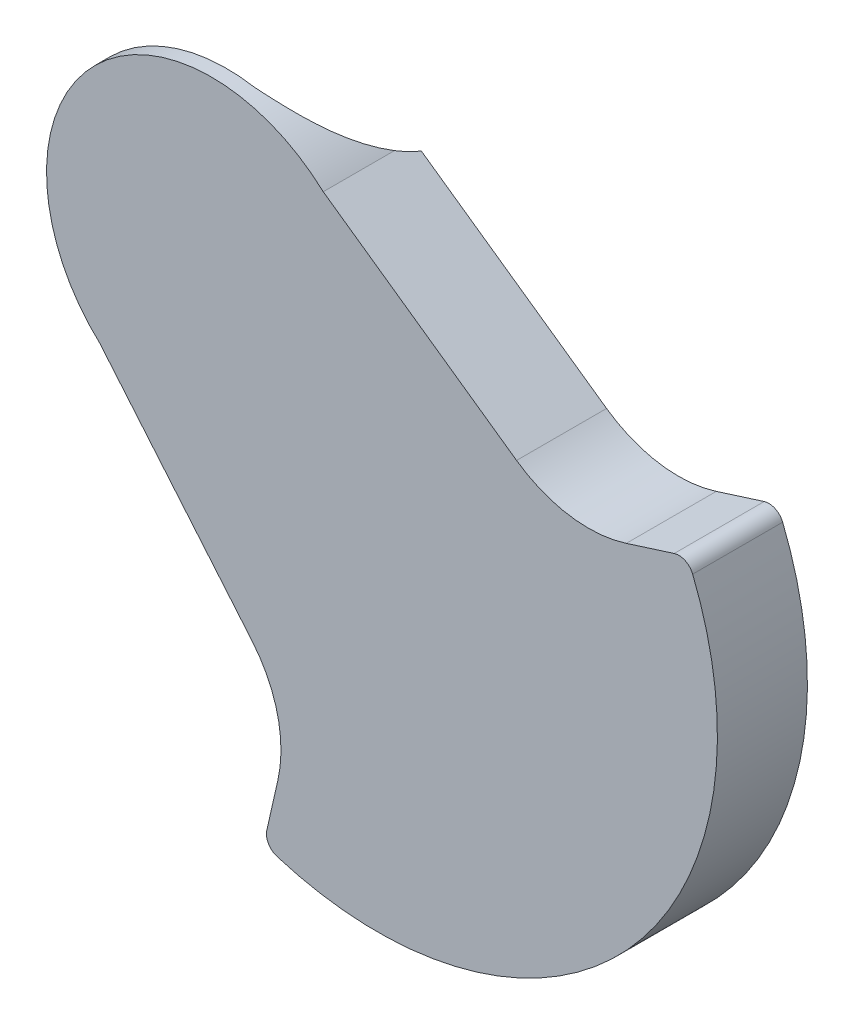
ISO-10303-21;
HEADER;
FILE_DESCRIPTION(('STEP AP214'),'2;1');
FILE_NAME('part.step','',(''),(''),'','','');
FILE_SCHEMA(('AUTOMOTIVE_DESIGN { 1 0 10303 214 1 1 1 1 }'));
ENDSEC;
DATA;
#1=APPLICATION_CONTEXT('core data for automotive mechanical design processes');
#2=APPLICATION_PROTOCOL_DEFINITION('international standard','automotive_design',2000,#1);
#3=PRODUCT_CONTEXT('',#1,'mechanical');
#4=PRODUCT('Part','Part','',(#3));
#5=PRODUCT_RELATED_PRODUCT_CATEGORY('part','',(#4));
#6=PRODUCT_DEFINITION_FORMATION('','',#4);
#7=PRODUCT_DEFINITION_CONTEXT('part definition',#1,'design');
#8=PRODUCT_DEFINITION('design','',#6,#7);
#9=PRODUCT_DEFINITION_SHAPE('','',#8);
#10=(LENGTH_UNIT() NAMED_UNIT(*) SI_UNIT(.MILLI.,.METRE.));
#11=(NAMED_UNIT(*) PLANE_ANGLE_UNIT() SI_UNIT($,.RADIAN.));
#12=(NAMED_UNIT(*) SI_UNIT($,.STERADIAN.) SOLID_ANGLE_UNIT());
#13=UNCERTAINTY_MEASURE_WITH_UNIT(LENGTH_MEASURE(1.E-05),#10,'distance_accuracy_value','');
#14=(GEOMETRIC_REPRESENTATION_CONTEXT(3) GLOBAL_UNCERTAINTY_ASSIGNED_CONTEXT((#13)) GLOBAL_UNIT_ASSIGNED_CONTEXT((#10,
#11,#12)) REPRESENTATION_CONTEXT('',''));
#15=CARTESIAN_POINT('',(0.,0.,0.));
#16=DIRECTION('',(0.,0.,1.));
#17=DIRECTION('',(1.,0.,0.));
#18=AXIS2_PLACEMENT_3D('',#15,#16,#17);
#19=CARTESIAN_POINT('',(-26.9907159954637,85.9098437319744,-364.369237082393));
#20=DIRECTION('',(0.,0.,1.));
#21=DIRECTION('',(0.,-1.,0.));
#22=AXIS2_PLACEMENT_3D('',#19,#20,#21);
#23=PLANE('',#22);
#24=DIRECTION('',(-0.676579799148893,-0.736369319963593,0.));
#25=VECTOR('',#24,1.);
#26=CARTESIAN_POINT('',(-15.8365381639596,75.6613295797509,-364.369237082393));
#27=LINE('',#26,#25);
#28=CARTESIAN_POINT('',(-27.5047740204315,62.9619688929353,-364.369237082393));
#29=VERTEX_POINT('',#28);
#30=CARTESIAN_POINT('',(-65.0604842308882,22.0874514698433,-364.369237082393));
#31=VERTEX_POINT('',#30);
#32=EDGE_CURVE('E131',#29,#31,#27,.T.);
#33=ORIENTED_EDGE('',*,*,#32,.T.);
#34=CARTESIAN_POINT('',(-33.1366193983653,30.4460909616992,-364.369237082393));
#35=DIRECTION('',(0.,0.,1.));
#36=DIRECTION('',(1.,0.,0.));
#37=AXIS2_PLACEMENT_3D('',#34,#35,#36);
#38=CIRCLE('',#37,33.);
#39=EDGE_CURVE('E266',#29,#31,#38,.T.);
#40=ORIENTED_EDGE('',*,*,#39,.F.);
#41=EDGE_LOOP('',(#33,#40));
#42=FACE_BOUND('',#41,.T.);
#43=ADVANCED_FACE('F17',(#42),#23,.F.);
#44=CARTESIAN_POINT('',(-18.0962882731668,77.7375992362456,-389.035665735474));
#45=DIRECTION('',(-0.676579799148893,-0.736369319963593,0.));
#46=DIRECTION('',(0.736369319963593,-0.676579799148893,0.));
#47=AXIS2_PLACEMENT_3D('',#44,#45,#46);
#48=CYLINDRICAL_SURFACE('',#47,24.8565900465059);
#49=DIRECTION('',(0.676579799148892,0.736369319963593,0.));
#50=VECTOR('',#49,1.);
#51=CARTESIAN_POINT('',(-54.1816294947552,4.61667075283123,-379.369237082393));
#52=LINE('',#51,#50);
#53=CARTESIAN_POINT('',(-54.1816294947552,4.61667075283121,-379.369237082393));
#54=VERTEX_POINT('',#53);
#55=CARTESIAN_POINT('',(-9.17740685872837,53.5979274496312,-379.369237082393));
#56=VERTEX_POINT('',#55);
#57=EDGE_CURVE('E112',#54,#56,#52,.T.);
#58=ORIENTED_EDGE('',*,*,#57,.F.);
#59=CARTESIAN_POINT('',(-69.0194913630283,22.3143003484863,-389.035665735474));
#60=DIRECTION('',(0.766304765262673,0.642477242192842,0.));
#61=DIRECTION('',(0.642477242192842,-0.766304765262673,0.));
#62=AXIS2_PLACEMENT_3D('',#59,#60,#61);
#63=ELLIPSE('',#62,25.0679920813008,24.8565900465059);
#64=CARTESIAN_POINT('',(-55.4637527702787,6.14590340290062,-375.613603542839));
#65=VERTEX_POINT('',#64);
#66=EDGE_CURVE('E264',#54,#65,#63,.F.);
#67=ORIENTED_EDGE('',*,*,#66,.T.);
#68=CARTESIAN_POINT('',(-65.0604842308881,22.0874514698431,-364.369237082393));
#69=CARTESIAN_POINT('',(-64.9840159927386,21.7953720487139,-364.400823792457));
#70=CARTESIAN_POINT('',(-64.9036362497375,21.5047657215805,-364.436634946942));
#71=CARTESIAN_POINT('',(-64.7353002869108,20.9269625260206,-364.517059269426));
#72=CARTESIAN_POINT('',(-64.6473434824417,20.639765922636,-364.561673116982));
#73=CARTESIAN_POINT('',(-64.4640760333072,20.0691792943719,-364.660070393074));
#74=CARTESIAN_POINT('',(-64.3687625296237,19.7857908001744,-364.713857396477));
#75=CARTESIAN_POINT('',(-64.1711418300038,19.2234671943748,-364.830881674098));
#76=CARTESIAN_POINT('',(-64.0688348072806,18.9445319726867,-364.894118714306));
#77=CARTESIAN_POINT('',(-63.7523431880267,18.1162072574784,-365.098165043031));
#78=CARTESIAN_POINT('',(-63.5281919455665,17.5740704030197,-365.253518237469));
#79=CARTESIAN_POINT('',(-63.0568663126145,16.5135515867837,-365.604511983135));
#80=CARTESIAN_POINT('',(-62.8096962041235,15.9951652335675,-365.800145049614));
#81=CARTESIAN_POINT('',(-62.2956374727821,14.9840660740643,-366.233087241402));
#82=CARTESIAN_POINT('',(-62.028692587333,14.4914339000559,-366.470518150075));
#83=CARTESIAN_POINT('',(-61.4804437872218,13.5366029944839,-366.986531070002));
#84=CARTESIAN_POINT('',(-61.1991386885859,13.0744067795282,-367.265116477968));
#85=CARTESIAN_POINT('',(-60.6273188787542,12.1829623308992,-367.862428695284));
#86=CARTESIAN_POINT('',(-60.3368054904221,11.7537093946334,-368.181149758125));
#87=CARTESIAN_POINT('',(-59.7517835654479,10.9297290725584,-368.857113567319));
#88=CARTESIAN_POINT('',(-59.4572752498287,10.5349997856247,-369.214354190081));
#89=CARTESIAN_POINT('',(-58.8756739602041,9.78888600617124,-369.957252897638));
#90=CARTESIAN_POINT('',(-58.5885560284565,9.43676062240041,-370.34214897427));
#91=CARTESIAN_POINT('',(-58.020106477675,8.76648690332238,-371.144500232092));
#92=CARTESIAN_POINT('',(-57.7387755805071,8.44834278628382,-371.561959444407));
#93=CARTESIAN_POINT('',(-57.186660856882,7.84604025878549,-372.426378156421));
#94=CARTESIAN_POINT('',(-56.9158664833569,7.56184724059178,-372.873306882615));
#95=CARTESIAN_POINT('',(-56.3886995673503,7.0264011915632,-373.794282777253));
#96=CARTESIAN_POINT('',(-56.1323202264009,6.77513255714503,-374.268316945717));
#97=CARTESIAN_POINT('',(-55.8132041742103,6.47147246414163,-374.89574385078));
#98=CARTESIAN_POINT('',(-55.7421343733781,6.40446150942822,-375.038012685529));
#99=CARTESIAN_POINT('',(-55.6016821650591,6.27316843986641,-375.324397305162));
#100=CARTESIAN_POINT('',(-55.532297964601,6.20888336586761,-375.468510853989));
#101=CARTESIAN_POINT('',(-55.4637527702787,6.1459034029006,-375.613603542839));
#102=B_SPLINE_CURVE_WITH_KNOTS('',3,(#68,#69,#70,#71,#72,#73,#74,#75,#76,#77,#78,#79,#80,#81,
#82,#83,#84,#85,#86,#87,#88,#89,#90,#91,#92,#93,#94,#95,#96,#97,#98,#99,#100,#101),
.UNSPECIFIED.,.F.,.F.,(4,2,2,2,2,2,2,2,2,2,2,2,2,2,2,2,4),(0.,0.910665562816889,
1.82140145532528,2.73249308472106,3.64356215669008,5.46179044311325,7.27968117326937,
9.10295897477726,10.9263873458348,12.7495549398196,14.5726220735728,16.3570820503147,
18.1417632843967,19.9246095107919,21.7066077277444,22.224304437158,22.7414239541458),.UNSPECIFIED.);
#103=EDGE_CURVE('E177',#31,#65,#102,.T.);
#104=ORIENTED_EDGE('',*,*,#103,.F.);
#105=ORIENTED_EDGE('',*,*,#32,.F.);
#106=CARTESIAN_POINT('',(-10.8094860264519,54.7462785204978,-375.613603542839));
#107=CARTESIAN_POINT('',(-10.9356589391007,54.862203413725,-375.34652875261));
#108=CARTESIAN_POINT('',(-11.0664855084637,54.9805986151833,-375.082761834512));
#109=CARTESIAN_POINT('',(-11.3376045254192,55.2218032106871,-374.562186668994));
#110=CARTESIAN_POINT('',(-11.4778974012697,55.3446128043231,-374.305378737138));
#111=CARTESIAN_POINT('',(-11.9132543943218,55.7189078987021,-373.545841129367));
#112=CARTESIAN_POINT('',(-12.2227458730638,55.9762123065114,-373.054106154957));
#113=CARTESIAN_POINT('',(-12.8806033239174,56.5012406774238,-372.103651379812));
#114=CARTESIAN_POINT('',(-13.2289553007062,56.7689608668827,-371.644919790428));
#115=CARTESIAN_POINT('',(-13.9648200256905,57.3096435252333,-370.763421294247));
#116=CARTESIAN_POINT('',(-14.3523265834485,57.5826051599294,-370.340648721645));
#117=CARTESIAN_POINT('',(-15.167988854671,58.1294876448721,-369.532095184414));
#118=CARTESIAN_POINT('',(-15.5963236875032,58.4034071176867,-369.146493694093));
#119=CARTESIAN_POINT('',(-16.4909081064042,58.9451023979783,-368.417095470555));
#120=CARTESIAN_POINT('',(-16.9571599437059,59.2128778394559,-368.073301222574));
#121=CARTESIAN_POINT('',(-17.9247804713075,59.736055513225,-367.429987513239));
#122=CARTESIAN_POINT('',(-18.4261050434514,59.9914726301869,-367.130413851745));
#123=CARTESIAN_POINT('',(-19.4612376238101,60.4846072939544,-366.576313640181));
#124=CARTESIAN_POINT('',(-19.995042045836,60.7223267883813,-366.32178212897));
#125=CARTESIAN_POINT('',(-21.0786827553908,61.169729511281,-365.863331076548));
#126=CARTESIAN_POINT('',(-21.6278742145385,61.3799291600736,-365.658388151964));
#127=CARTESIAN_POINT('',(-22.7495085764923,61.7743719832773,-365.291028645362));
#128=CARTESIAN_POINT('',(-23.3219557321771,61.9586103822536,-365.128619882574));
#129=CARTESIAN_POINT('',(-24.195873894524,62.2133071191776,-364.915401139943));
#130=CARTESIAN_POINT('',(-24.4905374626516,62.2947862902146,-364.849256872414));
#131=CARTESIAN_POINT('',(-25.083994345032,62.4499851256295,-364.727014801964));
#132=CARTESIAN_POINT('',(-25.3827877725527,62.5237045767051,-364.670917275183));
#133=CARTESIAN_POINT('',(-25.9837776051821,62.6630423394143,-364.568473032463));
#134=CARTESIAN_POINT('',(-26.28597264753,62.7286637774908,-364.522122548535));
#135=CARTESIAN_POINT('',(-26.8933013997838,62.8516011838212,-364.438767580703));
#136=CARTESIAN_POINT('',(-27.1984348604205,62.9089178500733,-364.401762311159));
#137=CARTESIAN_POINT('',(-27.5047740204315,62.9619688929353,-364.369237082393));
#138=B_SPLINE_CURVE_WITH_KNOTS('',3,(#106,#107,#108,#109,#110,#111,#112,#113,#114,#115,#116,
#117,#118,#119,#120,#121,#122,#123,#124,#125,#126,#127,#128,#129,#130,#131,#132,#133,#134,#135,
#136,#137),.UNSPECIFIED.,.F.,.F.,(4,2,2,2,2,2,2,2,2,2,2,2,2,2,2,4),(0.,0.951811090606709,
1.90366527028978,3.8077593276666,5.71116984000966,7.61427988785294,9.52616132703893,
11.4381563626768,13.3477880968241,15.2572093645925,17.1230103250728,18.9891540430135,
19.9273050023867,20.8654817433069,21.8032951365907,22.7410296629079),.UNSPECIFIED.);
#139=CARTESIAN_POINT('',(-10.8094860264518,54.7462785204978,-375.613603542839));
#140=VERTEX_POINT('',#139);
#141=EDGE_CURVE('E169',#140,#29,#138,.T.);
#142=ORIENTED_EDGE('',*,*,#141,.F.);
#143=CARTESIAN_POINT('',(-28.0652671067057,66.8876593272816,-389.035665735474));
#144=DIRECTION('',(-0.575443440708408,-0.817841577902266,0.));
#145=DIRECTION('',(-0.817841577902266,0.575443440708408,0.));
#146=AXIS2_PLACEMENT_3D('',#143,#144,#145);
#147=ELLIPSE('',#146,25.0679920813008,24.8565900465059);
#148=EDGE_CURVE('E165',#140,#56,#147,.F.);
#149=ORIENTED_EDGE('',*,*,#148,.T.);
#150=EDGE_LOOP('',(#58,#67,#104,#105,#142,#149));
#151=FACE_BOUND('',#150,.T.);
#152=ADVANCED_FACE('F182',(#151),#48,.F.);
#153=CARTESIAN_POINT('',(23.6802929702076,25.7729261987248,-379.369237082393));
#154=DIRECTION('',(0.,0.,-1.));
#155=DIRECTION('',(-1.,0.,0.));
#156=AXIS2_PLACEMENT_3D('',#153,#154,#155);
#157=PLANE('',#156);
#158=CARTESIAN_POINT('',(-44.2588979292362,-46.130397535221,-379.369237082393));
#159=DIRECTION('',(0.,0.,1.));
#160=DIRECTION('',(1.,0.,0.));
#161=AXIS2_PLACEMENT_3D('',#158,#159,#160);
#162=CIRCLE('',#161,25.);
#163=CARTESIAN_POINT('',(-19.8745176420868,-51.644198221833,-379.369237082393));
#164=VERTEX_POINT('',#163);
#165=CARTESIAN_POINT('',(-25.1012787976694,-30.0684664803999,-379.369237082393));
#166=VERTEX_POINT('',#165);
#167=EDGE_CURVE('E20',#164,#166,#162,.T.);
#168=ORIENTED_EDGE('',*,*,#167,.T.);
#169=DIRECTION('',(-0.642477242192842,0.766304765262673,0.));
#170=VECTOR('',#169,1.);
#171=CARTESIAN_POINT('',(-55.4637527702788,6.14590340290065,-379.369237082393));
#172=LINE('',#171,#170);
#173=EDGE_CURVE('E263',#166,#54,#172,.T.);
#174=ORIENTED_EDGE('',*,*,#173,.T.);
#175=ORIENTED_EDGE('',*,*,#57,.T.);
#176=DIRECTION('',(0.817841577902266,-0.575443440708408,0.));
#177=VECTOR('',#176,1.);
#178=CARTESIAN_POINT('',(-10.8094860264518,54.7462785204978,-379.369237082393));
#179=LINE('',#178,#177);
#180=CARTESIAN_POINT('',(27.8404333668362,27.5517176181,-379.369237082393));
#181=VERTEX_POINT('',#180);
#182=EDGE_CURVE('E164',#56,#181,#179,.T.);
#183=ORIENTED_EDGE('',*,*,#182,.T.);
#184=CARTESIAN_POINT('',(42.2265193845465,47.9977570656566,-379.369237082393));
#185=DIRECTION('',(0.,0.,1.));
#186=DIRECTION('',(1.,0.,0.));
#187=AXIS2_PLACEMENT_3D('',#184,#185,#186);
#188=CIRCLE('',#187,25.);
#189=CARTESIAN_POINT('',(49.7805909016473,24.166349144291,-379.369237082393));
#190=VERTEX_POINT('',#189);
#191=EDGE_CURVE('E161',#181,#190,#188,.T.);
#192=ORIENTED_EDGE('',*,*,#191,.T.);
#193=DIRECTION('',(0.953256316854624,0.302162860684031,0.));
#194=VECTOR('',#193,1.);
#195=CARTESIAN_POINT('',(49.7805909016474,24.166349144291,-379.369237082393));
#196=LINE('',#195,#194);
#197=CARTESIAN_POINT('',(59.3626873579173,27.2036787957015,-379.369237082393));
#198=VERTEX_POINT('',#197);
#199=EDGE_CURVE('E126',#190,#198,#196,.T.);
#200=ORIENTED_EDGE('',*,*,#199,.T.);
#201=CARTESIAN_POINT('',(60.2691759399694,24.3439098451376,-379.369237082393));
#202=DIRECTION('',(0.,0.,1.));
#203=DIRECTION('',(1.,0.,0.));
#204=AXIS2_PLACEMENT_3D('',#201,#202,#203);
#205=CIRCLE('',#204,3.00000000000001);
#206=CARTESIAN_POINT('',(63.0508299554324,25.4674760150881,-379.369237082393));
#207=VERTEX_POINT('',#206);
#208=EDGE_CURVE('E157',#207,#198,#205,.T.);
#209=ORIENTED_EDGE('',*,*,#208,.F.);
#210=CARTESIAN_POINT('',(-3.61315598883486E-12,-9.3791643271278E-13,-379.369237082393));
#211=DIRECTION('',(0.,0.,1.));
#212=DIRECTION('',(1.,0.,0.));
#213=AXIS2_PLACEMENT_3D('',#210,#211,#212);
#214=CIRCLE('',#213,67.9999962694734);
#215=CARTESIAN_POINT('',(-20.0499294278837,-64.9769176137615,-379.369237082393));
#216=VERTEX_POINT('',#215);
#217=EDGE_CURVE('E153',#216,#207,#214,.T.);
#218=ORIENTED_EDGE('',*,*,#217,.F.);
#219=CARTESIAN_POINT('',(-19.165372649062,-62.1102890530587,-379.369237082393));
#220=DIRECTION('',(0.,0.,1.));
#221=DIRECTION('',(1.,0.,0.));
#222=AXIS2_PLACEMENT_3D('',#219,#220,#221);
#223=CIRCLE('',#222,3.00000000000001);
#224=CARTESIAN_POINT('',(-22.0914982835199,-61.4486329706652,-379.369237082393));
#225=VERTEX_POINT('',#224);
#226=EDGE_CURVE('E119',#225,#216,#223,.T.);
#227=ORIENTED_EDGE('',*,*,#226,.F.);
#228=DIRECTION('',(0.220552027464475,0.975375211485975,0.));
#229=VECTOR('',#228,1.);
#230=CARTESIAN_POINT('',(-19.8745176420868,-51.644198221833,-379.369237082393));
#231=LINE('',#230,#229);
#232=EDGE_CURVE('E114',#225,#164,#231,.T.);
#233=ORIENTED_EDGE('',*,*,#232,.T.);
#234=EDGE_LOOP('',(#168,#174,#175,#183,#192,#200,#209,#218,#227,#233));
#235=FACE_BOUND('',#234,.T.);
#236=ADVANCED_FACE('F117',(#235),#157,.T.);
#237=CARTESIAN_POINT('',(-44.2588979292362,-46.130397535221,-570.536826632308));
#238=DIRECTION('',(0.,0.,1.));
#239=DIRECTION('',(1.,0.,0.));
#240=AXIS2_PLACEMENT_3D('',#237,#238,#239);
#241=CYLINDRICAL_SURFACE('',#240,25.);
#242=CARTESIAN_POINT('',(-44.2588979292362,-46.130397535221,-361.372382783964));
#243=DIRECTION('',(0.,0.,1.));
#244=DIRECTION('',(1.,0.,0.));
#245=AXIS2_PLACEMENT_3D('',#242,#243,#244);
#246=CIRCLE('',#245,25.);
#247=CARTESIAN_POINT('',(-19.8745176420868,-51.644198221833,-361.372382783964));
#248=VERTEX_POINT('',#247);
#249=CARTESIAN_POINT('',(-25.1012787976694,-30.0684664803999,-361.372382783964));
#250=VERTEX_POINT('',#249);
#251=EDGE_CURVE('E151',#248,#250,#246,.T.);
#252=ORIENTED_EDGE('',*,*,#251,.T.);
#253=DIRECTION('',(0.,0.,1.));
#254=VECTOR('',#253,1.);
#255=CARTESIAN_POINT('',(-25.1012787976694,-30.0684664803999,-570.536826632308));
#256=LINE('',#255,#254);
#257=EDGE_CURVE('E107',#250,#166,#256,.F.);
#258=ORIENTED_EDGE('',*,*,#257,.T.);
#259=ORIENTED_EDGE('',*,*,#167,.F.);
#260=DIRECTION('',(0.,0.,1.));
#261=VECTOR('',#260,1.);
#262=CARTESIAN_POINT('',(-19.8745176420868,-51.644198221833,-570.536826632308));
#263=LINE('',#262,#261);
#264=EDGE_CURVE('E106',#164,#248,#263,.T.);
#265=ORIENTED_EDGE('',*,*,#264,.T.);
#266=EDGE_LOOP('',(#252,#258,#259,#265));
#267=FACE_BOUND('',#266,.T.);
#268=ADVANCED_FACE('F105',(#267),#241,.F.);
#269=CARTESIAN_POINT('',(-55.4637527702788,6.14590340290064,-570.536826632308));
#270=DIRECTION('',(0.766304765262673,0.642477242192842,0.));
#271=DIRECTION('',(-0.642477242192842,0.766304765262673,0.));
#272=AXIS2_PLACEMENT_3D('',#269,#270,#271);
#273=PLANE('',#272);
#274=ORIENTED_EDGE('',*,*,#66,.F.);
#275=ORIENTED_EDGE('',*,*,#173,.F.);
#276=ORIENTED_EDGE('',*,*,#257,.F.);
#277=DIRECTION('',(-0.642477242192842,0.766304765262673,0.));
#278=VECTOR('',#277,1.);
#279=CARTESIAN_POINT('',(-25.1012787976694,-30.0684664803999,-361.372382783964));
#280=LINE('',#279,#278);
#281=CARTESIAN_POINT('',(-55.4637527702787,6.1459034029006,-361.372382783964));
#282=VERTEX_POINT('',#281);
#283=EDGE_CURVE('E150',#250,#282,#280,.T.);
#284=ORIENTED_EDGE('',*,*,#283,.T.);
#285=DIRECTION('',(0.,0.,1.));
#286=VECTOR('',#285,1.);
#287=CARTESIAN_POINT('',(-55.4637527702788,6.14590340290063,-570.536826632308));
#288=LINE('',#287,#286);
#289=EDGE_CURVE('E176',#65,#282,#288,.T.);
#290=ORIENTED_EDGE('',*,*,#289,.F.);
#291=EDGE_LOOP('',(#274,#275,#276,#284,#290));
#292=FACE_BOUND('',#291,.T.);
#293=ADVANCED_FACE('F191',(#292),#273,.F.);
#294=CARTESIAN_POINT('',(-33.1366193983653,30.4460909616992,-570.536826632308));
#295=DIRECTION('',(0.,0.,1.));
#296=DIRECTION('',(1.,0.,0.));
#297=AXIS2_PLACEMENT_3D('',#294,#295,#296);
#298=CYLINDRICAL_SURFACE('',#297,33.);
#299=DIRECTION('',(0.,0.,1.));
#300=VECTOR('',#299,1.);
#301=CARTESIAN_POINT('',(-10.8094860264518,54.7462785204978,-570.536826632308));
#302=LINE('',#301,#300);
#303=CARTESIAN_POINT('',(-10.8094860264518,54.7462785204978,-361.372382783964));
#304=VERTEX_POINT('',#303);
#305=EDGE_CURVE('E168',#304,#140,#302,.F.);
#306=ORIENTED_EDGE('',*,*,#305,.T.);
#307=ORIENTED_EDGE('',*,*,#141,.T.);
#308=ORIENTED_EDGE('',*,*,#39,.T.);
#309=ORIENTED_EDGE('',*,*,#103,.T.);
#310=ORIENTED_EDGE('',*,*,#289,.T.);
#311=CARTESIAN_POINT('',(-33.1366193983653,30.4460909616992,-361.372382783964));
#312=DIRECTION('',(0.,0.,1.));
#313=DIRECTION('',(1.,0.,0.));
#314=AXIS2_PLACEMENT_3D('',#311,#312,#313);
#315=CIRCLE('',#314,33.);
#316=EDGE_CURVE('E147',#282,#304,#315,.F.);
#317=ORIENTED_EDGE('',*,*,#316,.T.);
#318=EDGE_LOOP('',(#306,#307,#308,#309,#310,#317));
#319=FACE_BOUND('',#318,.T.);
#320=ADVANCED_FACE('F185',(#319),#298,.T.);
#321=CARTESIAN_POINT('',(-10.8094860264518,54.7462785204978,-570.536826632308));
#322=DIRECTION('',(-0.575443440708408,-0.817841577902266,0.));
#323=DIRECTION('',(0.817841577902266,-0.575443440708408,0.));
#324=AXIS2_PLACEMENT_3D('',#321,#322,#323);
#325=PLANE('',#324);
#326=ORIENTED_EDGE('',*,*,#148,.F.);
#327=ORIENTED_EDGE('',*,*,#305,.F.);
#328=DIRECTION('',(0.817841577902266,-0.575443440708409,0.));
#329=VECTOR('',#328,1.);
#330=CARTESIAN_POINT('',(-10.8094860264518,54.7462785204978,-361.372382783964));
#331=LINE('',#330,#329);
#332=CARTESIAN_POINT('',(27.8404333668362,27.5517176181,-361.372382783964));
#333=VERTEX_POINT('',#332);
#334=EDGE_CURVE('E146',#304,#333,#331,.T.);
#335=ORIENTED_EDGE('',*,*,#334,.T.);
#336=DIRECTION('',(0.,0.,1.));
#337=VECTOR('',#336,1.);
#338=CARTESIAN_POINT('',(27.8404333668362,27.5517176181,-570.536826632308));
#339=LINE('',#338,#337);
#340=EDGE_CURVE('E129',#333,#181,#339,.F.);
#341=ORIENTED_EDGE('',*,*,#340,.T.);
#342=ORIENTED_EDGE('',*,*,#182,.F.);
#343=EDGE_LOOP('',(#326,#327,#335,#341,#342));
#344=FACE_BOUND('',#343,.T.);
#345=ADVANCED_FACE('F190',(#344),#325,.F.);
#346=CARTESIAN_POINT('',(42.2265193845465,47.9977570656566,-570.536826632308));
#347=DIRECTION('',(0.,0.,1.));
#348=DIRECTION('',(1.,0.,0.));
#349=AXIS2_PLACEMENT_3D('',#346,#347,#348);
#350=CYLINDRICAL_SURFACE('',#349,25.);
#351=CARTESIAN_POINT('',(42.2265193845465,47.9977570656566,-361.372382783964));
#352=DIRECTION('',(0.,0.,1.));
#353=DIRECTION('',(1.,0.,0.));
#354=AXIS2_PLACEMENT_3D('',#351,#352,#353);
#355=CIRCLE('',#354,25.);
#356=CARTESIAN_POINT('',(49.7805909016473,24.166349144291,-361.372382783964));
#357=VERTEX_POINT('',#356);
#358=EDGE_CURVE('E143',#333,#357,#355,.T.);
#359=ORIENTED_EDGE('',*,*,#358,.T.);
#360=DIRECTION('',(0.,0.,1.));
#361=VECTOR('',#360,1.);
#362=CARTESIAN_POINT('',(49.7805909016474,24.166349144291,-570.536826632308));
#363=LINE('',#362,#361);
#364=EDGE_CURVE('E128',#357,#190,#363,.F.);
#365=ORIENTED_EDGE('',*,*,#364,.T.);
#366=ORIENTED_EDGE('',*,*,#191,.F.);
#367=ORIENTED_EDGE('',*,*,#340,.F.);
#368=EDGE_LOOP('',(#359,#365,#366,#367));
#369=FACE_BOUND('',#368,.T.);
#370=ADVANCED_FACE('F229',(#369),#350,.F.);
#371=CARTESIAN_POINT('',(49.7805909016474,24.166349144291,-570.536826632308));
#372=DIRECTION('',(0.302162860684031,-0.953256316854624,0.));
#373=DIRECTION('',(0.953256316854624,0.302162860684031,0.));
#374=AXIS2_PLACEMENT_3D('',#371,#372,#373);
#375=PLANE('',#374);
#376=DIRECTION('',(0.953256316854625,0.302162860684029,0.));
#377=VECTOR('',#376,1.);
#378=CARTESIAN_POINT('',(49.7805909016474,24.1663491442911,-361.372382783964));
#379=LINE('',#378,#377);
#380=CARTESIAN_POINT('',(59.3626873579173,27.2036787957015,-361.372382783964));
#381=VERTEX_POINT('',#380);
#382=EDGE_CURVE('E142',#357,#381,#379,.T.);
#383=ORIENTED_EDGE('',*,*,#382,.T.);
#384=DIRECTION('',(0.,0.,1.));
#385=VECTOR('',#384,1.);
#386=CARTESIAN_POINT('',(59.3626873579173,27.2036787957015,-570.536826632308));
#387=LINE('',#386,#385);
#388=EDGE_CURVE('E160',#198,#381,#387,.T.);
#389=ORIENTED_EDGE('',*,*,#388,.F.);
#390=ORIENTED_EDGE('',*,*,#199,.F.);
#391=ORIENTED_EDGE('',*,*,#364,.F.);
#392=EDGE_LOOP('',(#383,#389,#390,#391));
#393=FACE_BOUND('',#392,.T.);
#394=ADVANCED_FACE('F226',(#393),#375,.F.);
#395=CARTESIAN_POINT('',(60.2691759399694,24.3439098451376,-570.536826632308));
#396=DIRECTION('',(0.,0.,1.));
#397=DIRECTION('',(1.,0.,0.));
#398=AXIS2_PLACEMENT_3D('',#395,#396,#397);
#399=CYLINDRICAL_SURFACE('',#398,3.00000000000001);
#400=DIRECTION('',(0.,0.,1.));
#401=VECTOR('',#400,1.);
#402=CARTESIAN_POINT('',(63.0508295370961,25.4674770507786,-570.536826632308));
#403=LINE('',#402,#401);
#404=CARTESIAN_POINT('',(63.050829955432,25.467476015088,-361.372382783964));
#405=VERTEX_POINT('',#404);
#406=EDGE_CURVE('E156',#207,#405,#403,.T.);
#407=ORIENTED_EDGE('',*,*,#406,.F.);
#408=ORIENTED_EDGE('',*,*,#208,.T.);
#409=ORIENTED_EDGE('',*,*,#388,.T.);
#410=CARTESIAN_POINT('',(60.2691759399694,24.3439098451376,-361.372382783964));
#411=DIRECTION('',(0.,0.,1.));
#412=DIRECTION('',(1.,0.,0.));
#413=AXIS2_PLACEMENT_3D('',#410,#411,#412);
#414=CIRCLE('',#413,3.00000000000001);
#415=EDGE_CURVE('E139',#381,#405,#414,.F.);
#416=ORIENTED_EDGE('',*,*,#415,.T.);
#417=EDGE_LOOP('',(#407,#408,#409,#416));
#418=FACE_BOUND('',#417,.T.);
#419=ADVANCED_FACE('F222',(#418),#399,.T.);
#420=CARTESIAN_POINT('',(-3.62376795237651E-12,-9.37916411203332E-13,-570.536826632308));
#421=DIRECTION('',(0.,0.,1.));
#422=DIRECTION('',(1.,0.,0.));
#423=AXIS2_PLACEMENT_3D('',#420,#421,#422);
#424=CYLINDRICAL_SURFACE('',#423,67.9999962694734);
#425=DIRECTION('',(0.,0.,1.));
#426=VECTOR('',#425,1.);
#427=CARTESIAN_POINT('',(-20.0499304952128,-64.9769172844157,-570.536826632308));
#428=LINE('',#427,#426);
#429=CARTESIAN_POINT('',(-20.0499294278838,-64.9769176137619,-361.372382783964));
#430=VERTEX_POINT('',#429);
#431=EDGE_CURVE('E121',#216,#430,#428,.T.);
#432=ORIENTED_EDGE('',*,*,#431,.F.);
#433=ORIENTED_EDGE('',*,*,#217,.T.);
#434=ORIENTED_EDGE('',*,*,#406,.T.);
#435=CARTESIAN_POINT('',(-3.61215695985652E-12,-9.37916434737717E-13,-361.372382783964));
#436=DIRECTION('',(0.,0.,1.));
#437=DIRECTION('',(1.,0.,0.));
#438=AXIS2_PLACEMENT_3D('',#435,#436,#437);
#439=CIRCLE('',#438,67.9999962694734);
#440=EDGE_CURVE('E136',#405,#430,#439,.F.);
#441=ORIENTED_EDGE('',*,*,#440,.T.);
#442=EDGE_LOOP('',(#432,#433,#434,#441));
#443=FACE_BOUND('',#442,.T.);
#444=ADVANCED_FACE('F218',(#443),#424,.T.);
#445=CARTESIAN_POINT('',(-19.165372649062,-62.1102890530587,-570.536826632308));
#446=DIRECTION('',(0.,0.,1.));
#447=DIRECTION('',(1.,0.,0.));
#448=AXIS2_PLACEMENT_3D('',#445,#446,#447);
#449=CYLINDRICAL_SURFACE('',#448,3.00000000000001);
#450=DIRECTION('',(0.,0.,1.));
#451=VECTOR('',#450,1.);
#452=CARTESIAN_POINT('',(-22.0914982835199,-61.4486329706652,-570.536826632308));
#453=LINE('',#452,#451);
#454=CARTESIAN_POINT('',(-22.0914982835199,-61.4486329706652,-361.372382783964));
#455=VERTEX_POINT('',#454);
#456=EDGE_CURVE('E34',#455,#225,#453,.F.);
#457=ORIENTED_EDGE('',*,*,#456,.T.);
#458=ORIENTED_EDGE('',*,*,#226,.T.);
#459=ORIENTED_EDGE('',*,*,#431,.T.);
#460=CARTESIAN_POINT('',(-19.165372649062,-62.1102890530587,-361.372382783964));
#461=DIRECTION('',(0.,0.,1.));
#462=DIRECTION('',(1.,0.,0.));
#463=AXIS2_PLACEMENT_3D('',#460,#461,#462);
#464=CIRCLE('',#463,3.00000000000001);
#465=EDGE_CURVE('E26',#430,#455,#464,.F.);
#466=ORIENTED_EDGE('',*,*,#465,.T.);
#467=EDGE_LOOP('',(#457,#458,#459,#466));
#468=FACE_BOUND('',#467,.T.);
#469=ADVANCED_FACE('F212',(#468),#449,.T.);
#470=CARTESIAN_POINT('',(-19.8745176420868,-51.644198221833,-570.536826632308));
#471=DIRECTION('',(0.975375211485975,-0.220552027464475,0.));
#472=DIRECTION('',(0.220552027464475,0.975375211485975,0.));
#473=AXIS2_PLACEMENT_3D('',#470,#471,#472);
#474=PLANE('',#473);
#475=DIRECTION('',(0.220552027464476,0.975375211485974,0.));
#476=VECTOR('',#475,1.);
#477=CARTESIAN_POINT('',(-22.0914982835199,-61.4486329706653,-361.372382783964));
#478=LINE('',#477,#476);
#479=EDGE_CURVE('E11',#455,#248,#478,.T.);
#480=ORIENTED_EDGE('',*,*,#479,.T.);
#481=ORIENTED_EDGE('',*,*,#264,.F.);
#482=ORIENTED_EDGE('',*,*,#232,.F.);
#483=ORIENTED_EDGE('',*,*,#456,.F.);
#484=EDGE_LOOP('',(#480,#481,#482,#483));
#485=FACE_BOUND('',#484,.T.);
#486=ADVANCED_FACE('F113',(#485),#474,.F.);
#487=CARTESIAN_POINT('',(301.236169551111,-411.15464432894,-361.372382783964));
#488=DIRECTION('',(0.,0.,-1.));
#489=DIRECTION('',(-1.,0.,0.));
#490=AXIS2_PLACEMENT_3D('',#487,#488,#489);
#491=PLANE('',#490);
#492=ORIENTED_EDGE('',*,*,#465,.F.);
#493=ORIENTED_EDGE('',*,*,#440,.F.);
#494=ORIENTED_EDGE('',*,*,#415,.F.);
#495=ORIENTED_EDGE('',*,*,#382,.F.);
#496=ORIENTED_EDGE('',*,*,#358,.F.);
#497=ORIENTED_EDGE('',*,*,#334,.F.);
#498=ORIENTED_EDGE('',*,*,#316,.F.);
#499=ORIENTED_EDGE('',*,*,#283,.F.);
#500=ORIENTED_EDGE('',*,*,#251,.F.);
#501=ORIENTED_EDGE('',*,*,#479,.F.);
#502=EDGE_LOOP('',(#492,#493,#494,#495,#496,#497,#498,#499,#500,#501));
#503=FACE_BOUND('',#502,.T.);
#504=ADVANCED_FACE('F205',(#503),#491,.F.);
#505=CLOSED_SHELL('',(#43,#152,#236,#268,#293,#320,#345,#370,#394,#419,#444,#469,#486,#504));
#506=MANIFOLD_SOLID_BREP('B1',#505);
#507=ADVANCED_BREP_SHAPE_REPRESENTATION('',(#18,#506),#14);
#508=SHAPE_DEFINITION_REPRESENTATION(#9,#507);
ENDSEC;
END-ISO-10303-21;
